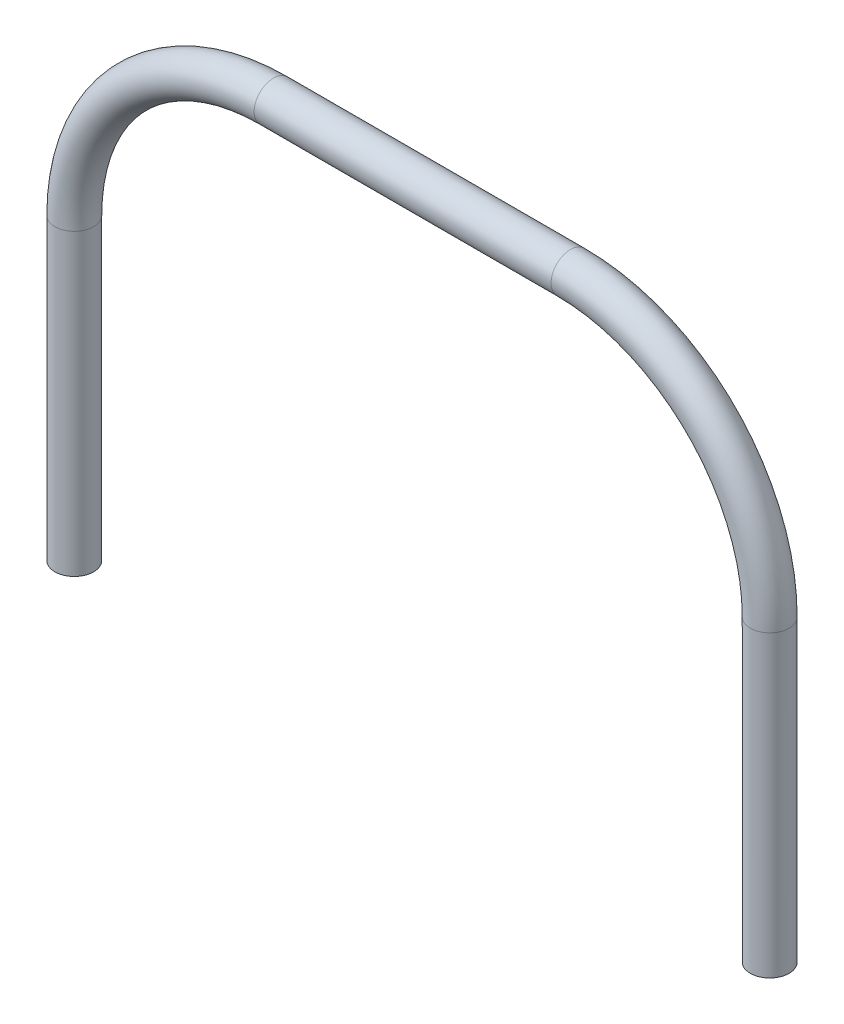
ISO-10303-21;
HEADER;
FILE_DESCRIPTION(('STEP AP214'),'2;1');
FILE_NAME('part.step','',(''),(''),'','','');
FILE_SCHEMA(('AUTOMOTIVE_DESIGN { 1 0 10303 214 1 1 1 1 }'));
ENDSEC;
DATA;
#1=APPLICATION_CONTEXT('core data for automotive mechanical design processes');
#2=APPLICATION_PROTOCOL_DEFINITION('international standard','automotive_design',2000,#1);
#3=PRODUCT_CONTEXT('',#1,'mechanical');
#4=PRODUCT('Part','Part','',(#3));
#5=PRODUCT_RELATED_PRODUCT_CATEGORY('part','',(#4));
#6=PRODUCT_DEFINITION_FORMATION('','',#4);
#7=PRODUCT_DEFINITION_CONTEXT('part definition',#1,'design');
#8=PRODUCT_DEFINITION('design','',#6,#7);
#9=PRODUCT_DEFINITION_SHAPE('','',#8);
#10=(LENGTH_UNIT() NAMED_UNIT(*) SI_UNIT(.MILLI.,.METRE.));
#11=(NAMED_UNIT(*) PLANE_ANGLE_UNIT() SI_UNIT($,.RADIAN.));
#12=(NAMED_UNIT(*) SI_UNIT($,.STERADIAN.) SOLID_ANGLE_UNIT());
#13=UNCERTAINTY_MEASURE_WITH_UNIT(LENGTH_MEASURE(1.E-05),#10,'distance_accuracy_value','');
#14=(GEOMETRIC_REPRESENTATION_CONTEXT(3) GLOBAL_UNCERTAINTY_ASSIGNED_CONTEXT((#13)) GLOBAL_UNIT_ASSIGNED_CONTEXT((#10,
#11,#12)) REPRESENTATION_CONTEXT('',''));
#15=CARTESIAN_POINT('',(0.,0.,0.));
#16=DIRECTION('',(0.,0.,1.));
#17=DIRECTION('',(1.,0.,0.));
#18=AXIS2_PLACEMENT_3D('',#15,#16,#17);
#19=CARTESIAN_POINT('',(0.,0.,0.));
#20=DIRECTION('',(0.,1.,0.));
#21=DIRECTION('',(0.,0.,1.));
#22=AXIS2_PLACEMENT_3D('',#19,#20,#21);
#23=PLANE('',#22);
#24=CARTESIAN_POINT('',(0.,0.,0.));
#25=DIRECTION('',(0.,1.,0.));
#26=DIRECTION('',(0.,0.,1.));
#27=AXIS2_PLACEMENT_3D('',#24,#25,#26);
#28=CIRCLE('',#27,9.75);
#29=CARTESIAN_POINT('',(0.,0.,9.75));
#30=VERTEX_POINT('',#29);
#31=EDGE_CURVE('E45',#30,#30,#28,.T.);
#32=ORIENTED_EDGE('',*,*,#31,.F.);
#33=EDGE_LOOP('',(#32));
#34=FACE_BOUND('',#33,.T.);
#35=ADVANCED_FACE('F33',(#34),#23,.F.);
#36=CARTESIAN_POINT('',(349.,0.,0.));
#37=DIRECTION('',(0.,-1.,0.));
#38=DIRECTION('',(0.,0.,1.));
#39=AXIS2_PLACEMENT_3D('',#36,#37,#38);
#40=PLANE('',#39);
#41=CARTESIAN_POINT('',(349.,0.,0.));
#42=DIRECTION('',(0.,-1.,0.));
#43=DIRECTION('',(0.,0.,1.));
#44=AXIS2_PLACEMENT_3D('',#41,#42,#43);
#45=CIRCLE('',#44,9.75);
#46=CARTESIAN_POINT('',(349.,0.,9.75));
#47=VERTEX_POINT('',#46);
#48=EDGE_CURVE('E11',#47,#47,#45,.T.);
#49=ORIENTED_EDGE('',*,*,#48,.T.);
#50=EDGE_LOOP('',(#49));
#51=FACE_BOUND('',#50,.T.);
#52=ADVANCED_FACE('F48',(#51),#40,.T.);
#53=CARTESIAN_POINT('',(0.,0.,0.));
#54=DIRECTION('',(0.,1.,0.));
#55=DIRECTION('',(0.,0.,1.));
#56=AXIS2_PLACEMENT_3D('',#53,#54,#55);
#57=CYLINDRICAL_SURFACE('',#56,9.75);
#58=CARTESIAN_POINT('',(0.,150.,0.));
#59=DIRECTION('',(0.,1.,0.));
#60=DIRECTION('',(0.,0.,1.));
#61=AXIS2_PLACEMENT_3D('',#58,#59,#60);
#62=CIRCLE('',#61,9.75);
#63=CARTESIAN_POINT('',(-9.74999999999998,150.,0.));
#64=VERTEX_POINT('',#63);
#65=EDGE_CURVE('E65',#64,#64,#62,.T.);
#66=ORIENTED_EDGE('',*,*,#65,.F.);
#67=EDGE_LOOP('',(#66));
#68=FACE_BOUND('',#67,.T.);
#69=ORIENTED_EDGE('',*,*,#31,.T.);
#70=EDGE_LOOP('',(#69));
#71=FACE_BOUND('',#70,.T.);
#72=ADVANCED_FACE('F69',(#68,#71),#57,.T.);
#73=CARTESIAN_POINT('',(100.,150.,0.));
#74=DIRECTION('',(0.,0.,-1.));
#75=DIRECTION('',(-1.,0.,0.));
#76=AXIS2_PLACEMENT_3D('',#73,#74,#75);
#77=TOROIDAL_SURFACE('',#76,100.,9.75);
#78=CARTESIAN_POINT('',(100.,250.,0.));
#79=DIRECTION('',(1.,0.,0.));
#80=DIRECTION('',(0.,0.,1.));
#81=AXIS2_PLACEMENT_3D('',#78,#79,#80);
#82=CIRCLE('',#81,9.75);
#83=CARTESIAN_POINT('',(100.,259.75,0.));
#84=VERTEX_POINT('',#83);
#85=EDGE_CURVE('E60',#84,#84,#82,.T.);
#86=CARTESIAN_POINT('',(100.,150.,0.));
#87=DIRECTION('',(0.,0.,-1.));
#88=DIRECTION('',(-1.,0.,0.));
#89=AXIS2_PLACEMENT_3D('',#86,#87,#88);
#90=CIRCLE('',#89,109.75);
#91=EDGE_CURVE('',#64,#84,#90,.T.);
#92=ORIENTED_EDGE('',*,*,#65,.T.);
#93=ORIENTED_EDGE('',*,*,#85,.F.);
#94=ORIENTED_EDGE('',*,*,#91,.T.);
#95=ORIENTED_EDGE('',*,*,#91,.F.);
#96=EDGE_LOOP('',(#92,#94,#93,#95));
#97=FACE_BOUND('',#96,.T.);
#98=ADVANCED_FACE('F71',(#97),#77,.T.);
#99=CARTESIAN_POINT('',(100.,250.,0.));
#100=DIRECTION('',(1.,0.,0.));
#101=DIRECTION('',(0.,1.,0.));
#102=AXIS2_PLACEMENT_3D('',#99,#100,#101);
#103=CYLINDRICAL_SURFACE('',#102,9.75);
#104=CARTESIAN_POINT('',(249.,250.,0.));
#105=DIRECTION('',(1.,0.,0.));
#106=DIRECTION('',(0.,0.,1.));
#107=AXIS2_PLACEMENT_3D('',#104,#105,#106);
#108=CIRCLE('',#107,9.75);
#109=CARTESIAN_POINT('',(249.,259.75,0.));
#110=VERTEX_POINT('',#109);
#111=EDGE_CURVE('E58',#110,#110,#108,.T.);
#112=ORIENTED_EDGE('',*,*,#111,.F.);
#113=EDGE_LOOP('',(#112));
#114=FACE_BOUND('',#113,.T.);
#115=ORIENTED_EDGE('',*,*,#85,.T.);
#116=EDGE_LOOP('',(#115));
#117=FACE_BOUND('',#116,.T.);
#118=ADVANCED_FACE('F78',(#114,#117),#103,.T.);
#119=CARTESIAN_POINT('',(249.,150.,0.));
#120=DIRECTION('',(0.,0.,-1.));
#121=DIRECTION('',(-1.,0.,0.));
#122=AXIS2_PLACEMENT_3D('',#119,#120,#121);
#123=TOROIDAL_SURFACE('',#122,100.,9.75);
#124=CARTESIAN_POINT('',(349.,150.,0.));
#125=DIRECTION('',(0.,-1.,0.));
#126=DIRECTION('',(0.,0.,1.));
#127=AXIS2_PLACEMENT_3D('',#124,#125,#126);
#128=CIRCLE('',#127,9.75);
#129=CARTESIAN_POINT('',(358.75,150.,0.));
#130=VERTEX_POINT('',#129);
#131=EDGE_CURVE('E40',#130,#130,#128,.T.);
#132=CARTESIAN_POINT('',(249.,150.,0.));
#133=DIRECTION('',(0.,0.,-1.));
#134=DIRECTION('',(-1.,0.,0.));
#135=AXIS2_PLACEMENT_3D('',#132,#133,#134);
#136=CIRCLE('',#135,109.75);
#137=EDGE_CURVE('',#110,#130,#136,.T.);
#138=ORIENTED_EDGE('',*,*,#111,.T.);
#139=ORIENTED_EDGE('',*,*,#131,.F.);
#140=ORIENTED_EDGE('',*,*,#137,.T.);
#141=ORIENTED_EDGE('',*,*,#137,.F.);
#142=EDGE_LOOP('',(#138,#140,#139,#141));
#143=FACE_BOUND('',#142,.T.);
#144=ADVANCED_FACE('F53',(#143),#123,.T.);
#145=CARTESIAN_POINT('',(349.,150.,0.));
#146=DIRECTION('',(0.,-1.,0.));
#147=DIRECTION('',(1.,0.,0.));
#148=AXIS2_PLACEMENT_3D('',#145,#146,#147);
#149=CYLINDRICAL_SURFACE('',#148,9.75);
#150=ORIENTED_EDGE('',*,*,#48,.F.);
#151=EDGE_LOOP('',(#150));
#152=FACE_BOUND('',#151,.T.);
#153=ORIENTED_EDGE('',*,*,#131,.T.);
#154=EDGE_LOOP('',(#153));
#155=FACE_BOUND('',#154,.T.);
#156=ADVANCED_FACE('F50',(#152,#155),#149,.T.);
#157=CLOSED_SHELL('',(#35,#52,#72,#98,#118,#144,#156));
#158=MANIFOLD_SOLID_BREP('B2',#157);
#159=ADVANCED_BREP_SHAPE_REPRESENTATION('',(#18,#158),#14);
#160=SHAPE_DEFINITION_REPRESENTATION(#9,#159);
ENDSEC;
END-ISO-10303-21;
